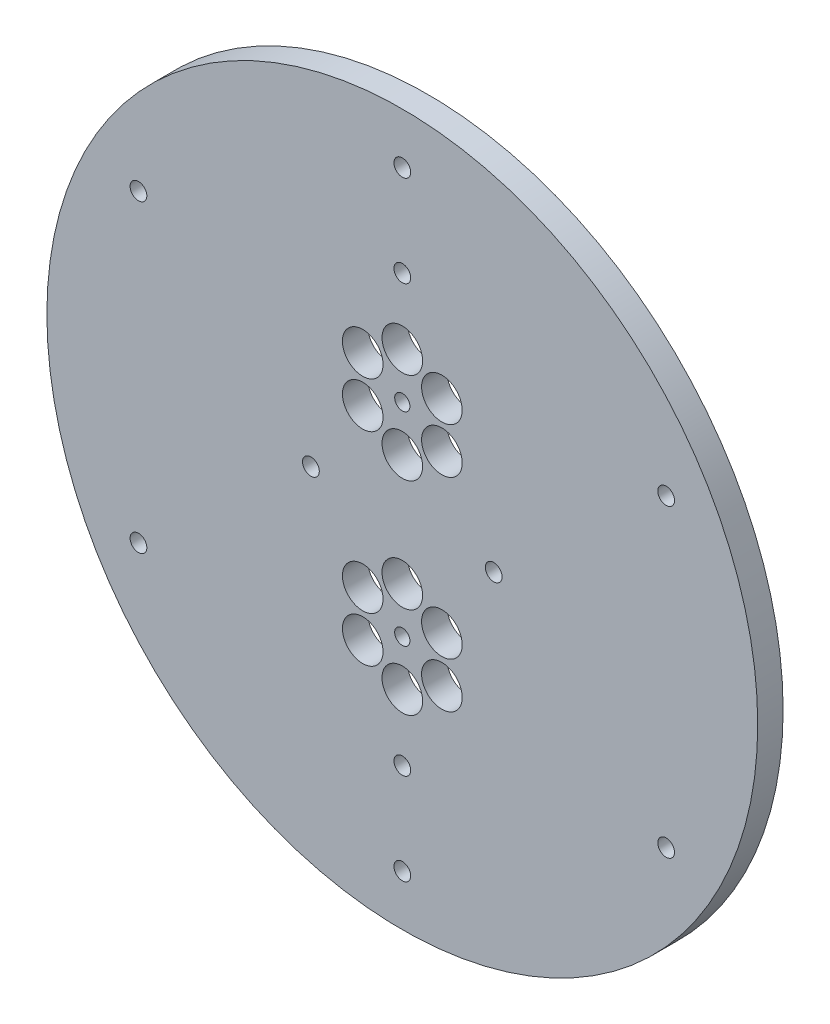
ISO-10303-21;
HEADER;
FILE_DESCRIPTION(('STEP AP214'),'2;1');
FILE_NAME('part.step','',(''),(''),'','','');
FILE_SCHEMA(('AUTOMOTIVE_DESIGN { 1 0 10303 214 1 1 1 1 }'));
ENDSEC;
DATA;
#1=APPLICATION_CONTEXT('core data for automotive mechanical design processes');
#2=APPLICATION_PROTOCOL_DEFINITION('international standard','automotive_design',2000,#1);
#3=PRODUCT_CONTEXT('',#1,'mechanical');
#4=PRODUCT('Part','Part','',(#3));
#5=PRODUCT_RELATED_PRODUCT_CATEGORY('part','',(#4));
#6=PRODUCT_DEFINITION_FORMATION('','',#4);
#7=PRODUCT_DEFINITION_CONTEXT('part definition',#1,'design');
#8=PRODUCT_DEFINITION('design','',#6,#7);
#9=PRODUCT_DEFINITION_SHAPE('','',#8);
#10=(LENGTH_UNIT() NAMED_UNIT(*) SI_UNIT(.MILLI.,.METRE.));
#11=(NAMED_UNIT(*) PLANE_ANGLE_UNIT() SI_UNIT($,.RADIAN.));
#12=(NAMED_UNIT(*) SI_UNIT($,.STERADIAN.) SOLID_ANGLE_UNIT());
#13=UNCERTAINTY_MEASURE_WITH_UNIT(LENGTH_MEASURE(1.E-05),#10,'distance_accuracy_value','');
#14=(GEOMETRIC_REPRESENTATION_CONTEXT(3) GLOBAL_UNCERTAINTY_ASSIGNED_CONTEXT((#13)) GLOBAL_UNIT_ASSIGNED_CONTEXT((#10,
#11,#12)) REPRESENTATION_CONTEXT('',''));
#15=CARTESIAN_POINT('',(0.,0.,0.));
#16=DIRECTION('',(0.,0.,1.));
#17=DIRECTION('',(1.,0.,0.));
#18=AXIS2_PLACEMENT_3D('',#15,#16,#17);
#19=CARTESIAN_POINT('',(0.,0.,5.));
#20=DIRECTION('',(0.,0.,1.));
#21=DIRECTION('',(1.,0.,0.));
#22=AXIS2_PLACEMENT_3D('',#19,#20,#21);
#23=PLANE('',#22);
#24=CARTESIAN_POINT('',(0.,42.,5.));
#25=DIRECTION('',(0.,0.,1.));
#26=DIRECTION('',(1.,0.,0.));
#27=AXIS2_PLACEMENT_3D('',#24,#25,#26);
#28=CIRCLE('',#27,1.65);
#29=CARTESIAN_POINT('',(1.65,42.,5.));
#30=VERTEX_POINT('',#29);
#31=EDGE_CURVE('E181',#30,#30,#28,.T.);
#32=ORIENTED_EDGE('',*,*,#31,.F.);
#33=EDGE_LOOP('',(#32));
#34=FACE_BOUND('',#33,.T.);
#35=CARTESIAN_POINT('',(0.,-42.,5.));
#36=DIRECTION('',(0.,0.,1.));
#37=DIRECTION('',(1.,0.,0.));
#38=AXIS2_PLACEMENT_3D('',#35,#36,#37);
#39=CIRCLE('',#38,1.65);
#40=CARTESIAN_POINT('',(1.65,-42.,5.));
#41=VERTEX_POINT('',#40);
#42=EDGE_CURVE('E175',#41,#41,#39,.T.);
#43=ORIENTED_EDGE('',*,*,#42,.F.);
#44=EDGE_LOOP('',(#43));
#45=FACE_BOUND('',#44,.T.);
#46=CARTESIAN_POINT('',(18.,0.,5.));
#47=DIRECTION('',(0.,0.,1.));
#48=DIRECTION('',(1.,0.,0.));
#49=AXIS2_PLACEMENT_3D('',#46,#47,#48);
#50=CIRCLE('',#49,1.65);
#51=CARTESIAN_POINT('',(19.65,0.,5.));
#52=VERTEX_POINT('',#51);
#53=EDGE_CURVE('E169',#52,#52,#50,.T.);
#54=ORIENTED_EDGE('',*,*,#53,.F.);
#55=EDGE_LOOP('',(#54));
#56=FACE_BOUND('',#55,.T.);
#57=CARTESIAN_POINT('',(-18.,0.,5.));
#58=DIRECTION('',(0.,0.,1.));
#59=DIRECTION('',(1.,0.,0.));
#60=AXIS2_PLACEMENT_3D('',#57,#58,#59);
#61=CIRCLE('',#60,1.65);
#62=CARTESIAN_POINT('',(-16.35,0.,5.));
#63=VERTEX_POINT('',#62);
#64=EDGE_CURVE('E163',#63,#63,#61,.T.);
#65=ORIENTED_EDGE('',*,*,#64,.F.);
#66=EDGE_LOOP('',(#65));
#67=FACE_BOUND('',#66,.T.);
#68=CARTESIAN_POINT('',(0.,-29.,5.));
#69=DIRECTION('',(0.,0.,1.));
#70=DIRECTION('',(-1.,0.,0.));
#71=AXIS2_PLACEMENT_3D('',#68,#69,#70);
#72=CIRCLE('',#71,4.);
#73=CARTESIAN_POINT('',(-4.,-29.,5.));
#74=VERTEX_POINT('',#73);
#75=EDGE_CURVE('E148',#74,#74,#72,.T.);
#76=ORIENTED_EDGE('',*,*,#75,.F.);
#77=EDGE_LOOP('',(#76));
#78=FACE_BOUND('',#77,.T.);
#79=CARTESIAN_POINT('',(0.,-20.,5.));
#80=DIRECTION('',(0.,0.,1.));
#81=DIRECTION('',(-1.,0.,0.));
#82=AXIS2_PLACEMENT_3D('',#79,#80,#81);
#83=CIRCLE('',#82,1.5);
#84=CARTESIAN_POINT('',(-1.5,-20.,5.));
#85=VERTEX_POINT('',#84);
#86=EDGE_CURVE('E136',#85,#85,#83,.T.);
#87=ORIENTED_EDGE('',*,*,#86,.F.);
#88=EDGE_LOOP('',(#87));
#89=FACE_BOUND('',#88,.T.);
#90=CARTESIAN_POINT('',(0.,-11.,5.));
#91=DIRECTION('',(0.,0.,1.));
#92=DIRECTION('',(-1.,0.,0.));
#93=AXIS2_PLACEMENT_3D('',#90,#91,#92);
#94=CIRCLE('',#93,4.);
#95=CARTESIAN_POINT('',(-3.99999999999999,-11.,5.));
#96=VERTEX_POINT('',#95);
#97=EDGE_CURVE('E124',#96,#96,#94,.T.);
#98=ORIENTED_EDGE('',*,*,#97,.F.);
#99=EDGE_LOOP('',(#98));
#100=FACE_BOUND('',#99,.T.);
#101=CARTESIAN_POINT('',(-7.79422863405994,24.5,5.));
#102=DIRECTION('',(0.,0.,1.));
#103=DIRECTION('',(1.,0.,0.));
#104=AXIS2_PLACEMENT_3D('',#101,#102,#103);
#105=CIRCLE('',#104,4.);
#106=CARTESIAN_POINT('',(-3.79422863405994,24.5,5.));
#107=VERTEX_POINT('',#106);
#108=EDGE_CURVE('E112',#107,#107,#105,.T.);
#109=ORIENTED_EDGE('',*,*,#108,.F.);
#110=EDGE_LOOP('',(#109));
#111=FACE_BOUND('',#110,.T.);
#112=CARTESIAN_POINT('',(0.,11.,5.));
#113=DIRECTION('',(0.,0.,1.));
#114=DIRECTION('',(1.,0.,0.));
#115=AXIS2_PLACEMENT_3D('',#112,#113,#114);
#116=CIRCLE('',#115,4.);
#117=CARTESIAN_POINT('',(4.00000000000001,11.,5.));
#118=VERTEX_POINT('',#117);
#119=EDGE_CURVE('E100',#118,#118,#116,.T.);
#120=ORIENTED_EDGE('',*,*,#119,.F.);
#121=EDGE_LOOP('',(#120));
#122=FACE_BOUND('',#121,.T.);
#123=CARTESIAN_POINT('',(7.79422863405995,24.5,5.));
#124=DIRECTION('',(0.,0.,1.));
#125=DIRECTION('',(1.,0.,0.));
#126=AXIS2_PLACEMENT_3D('',#123,#124,#125);
#127=CIRCLE('',#126,4.);
#128=CARTESIAN_POINT('',(11.79422863406,24.5,5.));
#129=VERTEX_POINT('',#128);
#130=EDGE_CURVE('E88',#129,#129,#127,.T.);
#131=ORIENTED_EDGE('',*,*,#130,.F.);
#132=EDGE_LOOP('',(#131));
#133=FACE_BOUND('',#132,.T.);
#134=CARTESIAN_POINT('',(0.,29.,5.));
#135=DIRECTION('',(0.,0.,1.));
#136=DIRECTION('',(1.,0.,0.));
#137=AXIS2_PLACEMENT_3D('',#134,#135,#136);
#138=CIRCLE('',#137,4.);
#139=CARTESIAN_POINT('',(4.,29.,5.));
#140=VERTEX_POINT('',#139);
#141=EDGE_CURVE('E76',#140,#140,#138,.T.);
#142=ORIENTED_EDGE('',*,*,#141,.F.);
#143=EDGE_LOOP('',(#142));
#144=FACE_BOUND('',#143,.T.);
#145=CARTESIAN_POINT('',(-51.9615242270663,-30.,5.));
#146=DIRECTION('',(0.,0.,1.));
#147=DIRECTION('',(1.,0.,0.));
#148=AXIS2_PLACEMENT_3D('',#145,#146,#147);
#149=CIRCLE('',#148,1.65);
#150=CARTESIAN_POINT('',(-50.3115242270663,-30.,5.));
#151=VERTEX_POINT('',#150);
#152=EDGE_CURVE('E64',#151,#151,#149,.T.);
#153=ORIENTED_EDGE('',*,*,#152,.F.);
#154=EDGE_LOOP('',(#153));
#155=FACE_BOUND('',#154,.T.);
#156=CARTESIAN_POINT('',(51.9615242270663,-30.,5.));
#157=DIRECTION('',(0.,0.,1.));
#158=DIRECTION('',(1.,0.,0.));
#159=AXIS2_PLACEMENT_3D('',#156,#157,#158);
#160=CIRCLE('',#159,1.65000000000015);
#161=CARTESIAN_POINT('',(53.6115242270665,-30.,5.));
#162=VERTEX_POINT('',#161);
#163=EDGE_CURVE('E52',#162,#162,#160,.T.);
#164=ORIENTED_EDGE('',*,*,#163,.F.);
#165=EDGE_LOOP('',(#164));
#166=FACE_BOUND('',#165,.T.);
#167=CARTESIAN_POINT('',(0.,60.,5.));
#168=DIRECTION('',(0.,0.,1.));
#169=DIRECTION('',(1.,0.,0.));
#170=AXIS2_PLACEMENT_3D('',#167,#168,#169);
#171=CIRCLE('',#170,1.65);
#172=CARTESIAN_POINT('',(1.65,60.,5.));
#173=VERTEX_POINT('',#172);
#174=EDGE_CURVE('E41',#173,#173,#171,.T.);
#175=ORIENTED_EDGE('',*,*,#174,.F.);
#176=EDGE_LOOP('',(#175));
#177=FACE_BOUND('',#176,.T.);
#178=CARTESIAN_POINT('',(0.,0.,5.));
#179=DIRECTION('',(0.,0.,1.));
#180=DIRECTION('',(1.,0.,0.));
#181=AXIS2_PLACEMENT_3D('',#178,#179,#180);
#182=CIRCLE('',#181,70.);
#183=CARTESIAN_POINT('',(70.,0.,5.));
#184=VERTEX_POINT('',#183);
#185=EDGE_CURVE('E10',#184,#184,#182,.T.);
#186=ORIENTED_EDGE('',*,*,#185,.T.);
#187=EDGE_LOOP('',(#186));
#188=FACE_BOUND('',#187,.T.);
#189=CARTESIAN_POINT('',(51.9615242270663,30.,5.));
#190=DIRECTION('',(0.,0.,1.));
#191=DIRECTION('',(1.,0.,0.));
#192=AXIS2_PLACEMENT_3D('',#189,#190,#191);
#193=CIRCLE('',#192,1.65000000000008);
#194=CARTESIAN_POINT('',(53.6115242270664,30.,5.));
#195=VERTEX_POINT('',#194);
#196=EDGE_CURVE('E46',#195,#195,#193,.T.);
#197=ORIENTED_EDGE('',*,*,#196,.F.);
#198=EDGE_LOOP('',(#197));
#199=FACE_BOUND('',#198,.T.);
#200=CARTESIAN_POINT('',(0.,-60.,5.));
#201=DIRECTION('',(0.,0.,1.));
#202=DIRECTION('',(1.,0.,0.));
#203=AXIS2_PLACEMENT_3D('',#200,#201,#202);
#204=CIRCLE('',#203,1.65);
#205=CARTESIAN_POINT('',(1.65000000000001,-60.,5.));
#206=VERTEX_POINT('',#205);
#207=EDGE_CURVE('E58',#206,#206,#204,.T.);
#208=ORIENTED_EDGE('',*,*,#207,.F.);
#209=EDGE_LOOP('',(#208));
#210=FACE_BOUND('',#209,.T.);
#211=CARTESIAN_POINT('',(-51.9615242270663,30.,5.));
#212=DIRECTION('',(0.,0.,1.));
#213=DIRECTION('',(1.,0.,0.));
#214=AXIS2_PLACEMENT_3D('',#211,#212,#213);
#215=CIRCLE('',#214,1.65);
#216=CARTESIAN_POINT('',(-50.3115242270664,30.,5.));
#217=VERTEX_POINT('',#216);
#218=EDGE_CURVE('E70',#217,#217,#215,.T.);
#219=ORIENTED_EDGE('',*,*,#218,.F.);
#220=EDGE_LOOP('',(#219));
#221=FACE_BOUND('',#220,.T.);
#222=CARTESIAN_POINT('',(0.,20.,5.));
#223=DIRECTION('',(0.,0.,1.));
#224=DIRECTION('',(1.,0.,0.));
#225=AXIS2_PLACEMENT_3D('',#222,#223,#224);
#226=CIRCLE('',#225,1.5);
#227=CARTESIAN_POINT('',(1.5,20.,5.));
#228=VERTEX_POINT('',#227);
#229=EDGE_CURVE('E82',#228,#228,#226,.T.);
#230=ORIENTED_EDGE('',*,*,#229,.F.);
#231=EDGE_LOOP('',(#230));
#232=FACE_BOUND('',#231,.T.);
#233=CARTESIAN_POINT('',(7.79422863405995,15.5,5.));
#234=DIRECTION('',(0.,0.,1.));
#235=DIRECTION('',(1.,0.,0.));
#236=AXIS2_PLACEMENT_3D('',#233,#234,#235);
#237=CIRCLE('',#236,4.);
#238=CARTESIAN_POINT('',(11.79422863406,15.5,5.));
#239=VERTEX_POINT('',#238);
#240=EDGE_CURVE('E94',#239,#239,#237,.T.);
#241=ORIENTED_EDGE('',*,*,#240,.F.);
#242=EDGE_LOOP('',(#241));
#243=FACE_BOUND('',#242,.T.);
#244=CARTESIAN_POINT('',(-7.79422863405994,15.5,5.));
#245=DIRECTION('',(0.,0.,1.));
#246=DIRECTION('',(1.,0.,0.));
#247=AXIS2_PLACEMENT_3D('',#244,#245,#246);
#248=CIRCLE('',#247,4.);
#249=CARTESIAN_POINT('',(-3.79422863405994,15.5,5.));
#250=VERTEX_POINT('',#249);
#251=EDGE_CURVE('E106',#250,#250,#248,.T.);
#252=ORIENTED_EDGE('',*,*,#251,.F.);
#253=EDGE_LOOP('',(#252));
#254=FACE_BOUND('',#253,.T.);
#255=CARTESIAN_POINT('',(7.79422863405995,-15.5,5.));
#256=DIRECTION('',(0.,0.,1.));
#257=DIRECTION('',(-1.,0.,0.));
#258=AXIS2_PLACEMENT_3D('',#255,#256,#257);
#259=CIRCLE('',#258,4.);
#260=CARTESIAN_POINT('',(3.79422863405995,-15.5,5.));
#261=VERTEX_POINT('',#260);
#262=EDGE_CURVE('E118',#261,#261,#259,.T.);
#263=ORIENTED_EDGE('',*,*,#262,.F.);
#264=EDGE_LOOP('',(#263));
#265=FACE_BOUND('',#264,.T.);
#266=CARTESIAN_POINT('',(-7.79422863405994,-15.5,5.));
#267=DIRECTION('',(0.,0.,1.));
#268=DIRECTION('',(-1.,0.,0.));
#269=AXIS2_PLACEMENT_3D('',#266,#267,#268);
#270=CIRCLE('',#269,4.);
#271=CARTESIAN_POINT('',(-11.7942286340599,-15.5,5.));
#272=VERTEX_POINT('',#271);
#273=EDGE_CURVE('E130',#272,#272,#270,.T.);
#274=ORIENTED_EDGE('',*,*,#273,.F.);
#275=EDGE_LOOP('',(#274));
#276=FACE_BOUND('',#275,.T.);
#277=CARTESIAN_POINT('',(-7.79422863405994,-24.5,5.));
#278=DIRECTION('',(0.,0.,1.));
#279=DIRECTION('',(-1.,0.,0.));
#280=AXIS2_PLACEMENT_3D('',#277,#278,#279);
#281=CIRCLE('',#280,4.);
#282=CARTESIAN_POINT('',(-11.7942286340599,-24.5,5.));
#283=VERTEX_POINT('',#282);
#284=EDGE_CURVE('E142',#283,#283,#281,.T.);
#285=ORIENTED_EDGE('',*,*,#284,.F.);
#286=EDGE_LOOP('',(#285));
#287=FACE_BOUND('',#286,.T.);
#288=CARTESIAN_POINT('',(7.79422863405995,-24.5,5.));
#289=DIRECTION('',(0.,0.,1.));
#290=DIRECTION('',(-1.,0.,0.));
#291=AXIS2_PLACEMENT_3D('',#288,#289,#290);
#292=CIRCLE('',#291,4.);
#293=CARTESIAN_POINT('',(3.79422863405995,-24.5,5.));
#294=VERTEX_POINT('',#293);
#295=EDGE_CURVE('E154',#294,#294,#292,.T.);
#296=ORIENTED_EDGE('',*,*,#295,.F.);
#297=EDGE_LOOP('',(#296));
#298=FACE_BOUND('',#297,.T.);
#299=ADVANCED_FACE('F30',(#34,#45,#56,#67,#78,#89,#100,#111,#122,#133,#144,#155,#166,#177,#188,
#199,#210,#221,#232,#243,#254,#265,#276,#287,#298),#23,.T.);
#300=CARTESIAN_POINT('',(0.,0.,0.));
#301=DIRECTION('',(0.,0.,1.));
#302=DIRECTION('',(1.,0.,0.));
#303=AXIS2_PLACEMENT_3D('',#300,#301,#302);
#304=PLANE('',#303);
#305=CARTESIAN_POINT('',(0.,42.,0.));
#306=DIRECTION('',(0.,0.,1.));
#307=DIRECTION('',(1.,0.,0.));
#308=AXIS2_PLACEMENT_3D('',#305,#306,#307);
#309=CIRCLE('',#308,1.65);
#310=CARTESIAN_POINT('',(1.65,42.,0.));
#311=VERTEX_POINT('',#310);
#312=EDGE_CURVE('E160',#311,#311,#309,.T.);
#313=ORIENTED_EDGE('',*,*,#312,.T.);
#314=EDGE_LOOP('',(#313));
#315=FACE_BOUND('',#314,.T.);
#316=CARTESIAN_POINT('',(0.,-42.,0.));
#317=DIRECTION('',(0.,0.,1.));
#318=DIRECTION('',(1.,0.,0.));
#319=AXIS2_PLACEMENT_3D('',#316,#317,#318);
#320=CIRCLE('',#319,1.65);
#321=CARTESIAN_POINT('',(1.65,-42.,0.));
#322=VERTEX_POINT('',#321);
#323=EDGE_CURVE('E178',#322,#322,#320,.T.);
#324=ORIENTED_EDGE('',*,*,#323,.T.);
#325=EDGE_LOOP('',(#324));
#326=FACE_BOUND('',#325,.T.);
#327=CARTESIAN_POINT('',(18.,0.,0.));
#328=DIRECTION('',(0.,0.,1.));
#329=DIRECTION('',(1.,0.,0.));
#330=AXIS2_PLACEMENT_3D('',#327,#328,#329);
#331=CIRCLE('',#330,1.65);
#332=CARTESIAN_POINT('',(19.65,0.,0.));
#333=VERTEX_POINT('',#332);
#334=EDGE_CURVE('E172',#333,#333,#331,.T.);
#335=ORIENTED_EDGE('',*,*,#334,.T.);
#336=EDGE_LOOP('',(#335));
#337=FACE_BOUND('',#336,.T.);
#338=CARTESIAN_POINT('',(-18.,0.,0.));
#339=DIRECTION('',(0.,0.,1.));
#340=DIRECTION('',(1.,0.,0.));
#341=AXIS2_PLACEMENT_3D('',#338,#339,#340);
#342=CIRCLE('',#341,1.65);
#343=CARTESIAN_POINT('',(-16.35,0.,0.));
#344=VERTEX_POINT('',#343);
#345=EDGE_CURVE('E166',#344,#344,#342,.T.);
#346=ORIENTED_EDGE('',*,*,#345,.T.);
#347=EDGE_LOOP('',(#346));
#348=FACE_BOUND('',#347,.T.);
#349=CARTESIAN_POINT('',(0.,0.,0.));
#350=DIRECTION('',(0.,0.,1.));
#351=DIRECTION('',(1.,0.,0.));
#352=AXIS2_PLACEMENT_3D('',#349,#350,#351);
#353=CIRCLE('',#352,70.);
#354=CARTESIAN_POINT('',(70.,0.,0.));
#355=VERTEX_POINT('',#354);
#356=EDGE_CURVE('E34',#355,#355,#353,.T.);
#357=ORIENTED_EDGE('',*,*,#356,.F.);
#358=EDGE_LOOP('',(#357));
#359=FACE_BOUND('',#358,.T.);
#360=CARTESIAN_POINT('',(0.,60.,0.));
#361=DIRECTION('',(0.,0.,1.));
#362=DIRECTION('',(1.,0.,0.));
#363=AXIS2_PLACEMENT_3D('',#360,#361,#362);
#364=CIRCLE('',#363,1.65);
#365=CARTESIAN_POINT('',(1.65,60.,0.));
#366=VERTEX_POINT('',#365);
#367=EDGE_CURVE('E43',#366,#366,#364,.T.);
#368=ORIENTED_EDGE('',*,*,#367,.T.);
#369=EDGE_LOOP('',(#368));
#370=FACE_BOUND('',#369,.T.);
#371=CARTESIAN_POINT('',(51.9615242270663,30.,0.));
#372=DIRECTION('',(0.,0.,1.));
#373=DIRECTION('',(1.,0.,0.));
#374=AXIS2_PLACEMENT_3D('',#371,#372,#373);
#375=CIRCLE('',#374,1.65000000000008);
#376=CARTESIAN_POINT('',(53.6115242270664,30.,0.));
#377=VERTEX_POINT('',#376);
#378=EDGE_CURVE('E49',#377,#377,#375,.T.);
#379=ORIENTED_EDGE('',*,*,#378,.T.);
#380=EDGE_LOOP('',(#379));
#381=FACE_BOUND('',#380,.T.);
#382=CARTESIAN_POINT('',(51.9615242270663,-30.,0.));
#383=DIRECTION('',(0.,0.,1.));
#384=DIRECTION('',(1.,0.,0.));
#385=AXIS2_PLACEMENT_3D('',#382,#383,#384);
#386=CIRCLE('',#385,1.65000000000015);
#387=CARTESIAN_POINT('',(53.6115242270665,-30.,0.));
#388=VERTEX_POINT('',#387);
#389=EDGE_CURVE('E55',#388,#388,#386,.T.);
#390=ORIENTED_EDGE('',*,*,#389,.T.);
#391=EDGE_LOOP('',(#390));
#392=FACE_BOUND('',#391,.T.);
#393=CARTESIAN_POINT('',(0.,-60.,0.));
#394=DIRECTION('',(0.,0.,1.));
#395=DIRECTION('',(1.,0.,0.));
#396=AXIS2_PLACEMENT_3D('',#393,#394,#395);
#397=CIRCLE('',#396,1.65);
#398=CARTESIAN_POINT('',(1.65000000000001,-60.,0.));
#399=VERTEX_POINT('',#398);
#400=EDGE_CURVE('E61',#399,#399,#397,.T.);
#401=ORIENTED_EDGE('',*,*,#400,.T.);
#402=EDGE_LOOP('',(#401));
#403=FACE_BOUND('',#402,.T.);
#404=CARTESIAN_POINT('',(-51.9615242270663,-30.,0.));
#405=DIRECTION('',(0.,0.,1.));
#406=DIRECTION('',(1.,0.,0.));
#407=AXIS2_PLACEMENT_3D('',#404,#405,#406);
#408=CIRCLE('',#407,1.65);
#409=CARTESIAN_POINT('',(-50.3115242270663,-30.,0.));
#410=VERTEX_POINT('',#409);
#411=EDGE_CURVE('E67',#410,#410,#408,.T.);
#412=ORIENTED_EDGE('',*,*,#411,.T.);
#413=EDGE_LOOP('',(#412));
#414=FACE_BOUND('',#413,.T.);
#415=CARTESIAN_POINT('',(-51.9615242270663,30.,0.));
#416=DIRECTION('',(0.,0.,1.));
#417=DIRECTION('',(1.,0.,0.));
#418=AXIS2_PLACEMENT_3D('',#415,#416,#417);
#419=CIRCLE('',#418,1.65);
#420=CARTESIAN_POINT('',(-50.3115242270664,30.,0.));
#421=VERTEX_POINT('',#420);
#422=EDGE_CURVE('E73',#421,#421,#419,.T.);
#423=ORIENTED_EDGE('',*,*,#422,.T.);
#424=EDGE_LOOP('',(#423));
#425=FACE_BOUND('',#424,.T.);
#426=CARTESIAN_POINT('',(0.,29.,0.));
#427=DIRECTION('',(0.,0.,1.));
#428=DIRECTION('',(1.,0.,0.));
#429=AXIS2_PLACEMENT_3D('',#426,#427,#428);
#430=CIRCLE('',#429,4.);
#431=CARTESIAN_POINT('',(4.,29.,0.));
#432=VERTEX_POINT('',#431);
#433=EDGE_CURVE('E79',#432,#432,#430,.T.);
#434=ORIENTED_EDGE('',*,*,#433,.T.);
#435=EDGE_LOOP('',(#434));
#436=FACE_BOUND('',#435,.T.);
#437=CARTESIAN_POINT('',(0.,20.,0.));
#438=DIRECTION('',(0.,0.,1.));
#439=DIRECTION('',(1.,0.,0.));
#440=AXIS2_PLACEMENT_3D('',#437,#438,#439);
#441=CIRCLE('',#440,1.5);
#442=CARTESIAN_POINT('',(1.5,20.,0.));
#443=VERTEX_POINT('',#442);
#444=EDGE_CURVE('E85',#443,#443,#441,.T.);
#445=ORIENTED_EDGE('',*,*,#444,.T.);
#446=EDGE_LOOP('',(#445));
#447=FACE_BOUND('',#446,.T.);
#448=CARTESIAN_POINT('',(7.79422863405995,24.5,0.));
#449=DIRECTION('',(0.,0.,1.));
#450=DIRECTION('',(1.,0.,0.));
#451=AXIS2_PLACEMENT_3D('',#448,#449,#450);
#452=CIRCLE('',#451,4.);
#453=CARTESIAN_POINT('',(11.79422863406,24.5,0.));
#454=VERTEX_POINT('',#453);
#455=EDGE_CURVE('E91',#454,#454,#452,.T.);
#456=ORIENTED_EDGE('',*,*,#455,.T.);
#457=EDGE_LOOP('',(#456));
#458=FACE_BOUND('',#457,.T.);
#459=CARTESIAN_POINT('',(7.79422863405995,15.5,0.));
#460=DIRECTION('',(0.,0.,1.));
#461=DIRECTION('',(1.,0.,0.));
#462=AXIS2_PLACEMENT_3D('',#459,#460,#461);
#463=CIRCLE('',#462,4.);
#464=CARTESIAN_POINT('',(11.79422863406,15.5,0.));
#465=VERTEX_POINT('',#464);
#466=EDGE_CURVE('E97',#465,#465,#463,.T.);
#467=ORIENTED_EDGE('',*,*,#466,.T.);
#468=EDGE_LOOP('',(#467));
#469=FACE_BOUND('',#468,.T.);
#470=CARTESIAN_POINT('',(0.,11.,0.));
#471=DIRECTION('',(0.,0.,1.));
#472=DIRECTION('',(1.,0.,0.));
#473=AXIS2_PLACEMENT_3D('',#470,#471,#472);
#474=CIRCLE('',#473,4.);
#475=CARTESIAN_POINT('',(4.00000000000001,11.,0.));
#476=VERTEX_POINT('',#475);
#477=EDGE_CURVE('E103',#476,#476,#474,.T.);
#478=ORIENTED_EDGE('',*,*,#477,.T.);
#479=EDGE_LOOP('',(#478));
#480=FACE_BOUND('',#479,.T.);
#481=CARTESIAN_POINT('',(-7.79422863405994,15.5,0.));
#482=DIRECTION('',(0.,0.,1.));
#483=DIRECTION('',(1.,0.,0.));
#484=AXIS2_PLACEMENT_3D('',#481,#482,#483);
#485=CIRCLE('',#484,4.);
#486=CARTESIAN_POINT('',(-3.79422863405994,15.5,0.));
#487=VERTEX_POINT('',#486);
#488=EDGE_CURVE('E109',#487,#487,#485,.T.);
#489=ORIENTED_EDGE('',*,*,#488,.T.);
#490=EDGE_LOOP('',(#489));
#491=FACE_BOUND('',#490,.T.);
#492=CARTESIAN_POINT('',(-7.79422863405994,24.5,0.));
#493=DIRECTION('',(0.,0.,1.));
#494=DIRECTION('',(1.,0.,0.));
#495=AXIS2_PLACEMENT_3D('',#492,#493,#494);
#496=CIRCLE('',#495,4.);
#497=CARTESIAN_POINT('',(-3.79422863405994,24.5,0.));
#498=VERTEX_POINT('',#497);
#499=EDGE_CURVE('E115',#498,#498,#496,.T.);
#500=ORIENTED_EDGE('',*,*,#499,.T.);
#501=EDGE_LOOP('',(#500));
#502=FACE_BOUND('',#501,.T.);
#503=CARTESIAN_POINT('',(7.79422863405995,-15.5,0.));
#504=DIRECTION('',(0.,0.,1.));
#505=DIRECTION('',(-1.,0.,0.));
#506=AXIS2_PLACEMENT_3D('',#503,#504,#505);
#507=CIRCLE('',#506,4.);
#508=CARTESIAN_POINT('',(3.79422863405995,-15.5,0.));
#509=VERTEX_POINT('',#508);
#510=EDGE_CURVE('E121',#509,#509,#507,.T.);
#511=ORIENTED_EDGE('',*,*,#510,.T.);
#512=EDGE_LOOP('',(#511));
#513=FACE_BOUND('',#512,.T.);
#514=CARTESIAN_POINT('',(0.,-11.,0.));
#515=DIRECTION('',(0.,0.,1.));
#516=DIRECTION('',(-1.,0.,0.));
#517=AXIS2_PLACEMENT_3D('',#514,#515,#516);
#518=CIRCLE('',#517,4.);
#519=CARTESIAN_POINT('',(-3.99999999999999,-11.,0.));
#520=VERTEX_POINT('',#519);
#521=EDGE_CURVE('E127',#520,#520,#518,.T.);
#522=ORIENTED_EDGE('',*,*,#521,.T.);
#523=EDGE_LOOP('',(#522));
#524=FACE_BOUND('',#523,.T.);
#525=CARTESIAN_POINT('',(-7.79422863405994,-15.5,0.));
#526=DIRECTION('',(0.,0.,1.));
#527=DIRECTION('',(-1.,0.,0.));
#528=AXIS2_PLACEMENT_3D('',#525,#526,#527);
#529=CIRCLE('',#528,4.);
#530=CARTESIAN_POINT('',(-11.7942286340599,-15.5,0.));
#531=VERTEX_POINT('',#530);
#532=EDGE_CURVE('E133',#531,#531,#529,.T.);
#533=ORIENTED_EDGE('',*,*,#532,.T.);
#534=EDGE_LOOP('',(#533));
#535=FACE_BOUND('',#534,.T.);
#536=CARTESIAN_POINT('',(0.,-20.,0.));
#537=DIRECTION('',(0.,0.,1.));
#538=DIRECTION('',(-1.,0.,0.));
#539=AXIS2_PLACEMENT_3D('',#536,#537,#538);
#540=CIRCLE('',#539,1.5);
#541=CARTESIAN_POINT('',(-1.5,-20.,0.));
#542=VERTEX_POINT('',#541);
#543=EDGE_CURVE('E139',#542,#542,#540,.T.);
#544=ORIENTED_EDGE('',*,*,#543,.T.);
#545=EDGE_LOOP('',(#544));
#546=FACE_BOUND('',#545,.T.);
#547=CARTESIAN_POINT('',(-7.79422863405994,-24.5,0.));
#548=DIRECTION('',(0.,0.,1.));
#549=DIRECTION('',(-1.,0.,0.));
#550=AXIS2_PLACEMENT_3D('',#547,#548,#549);
#551=CIRCLE('',#550,4.);
#552=CARTESIAN_POINT('',(-11.7942286340599,-24.5,0.));
#553=VERTEX_POINT('',#552);
#554=EDGE_CURVE('E145',#553,#553,#551,.T.);
#555=ORIENTED_EDGE('',*,*,#554,.T.);
#556=EDGE_LOOP('',(#555));
#557=FACE_BOUND('',#556,.T.);
#558=CARTESIAN_POINT('',(0.,-29.,0.));
#559=DIRECTION('',(0.,0.,1.));
#560=DIRECTION('',(-1.,0.,0.));
#561=AXIS2_PLACEMENT_3D('',#558,#559,#560);
#562=CIRCLE('',#561,4.);
#563=CARTESIAN_POINT('',(-4.,-29.,0.));
#564=VERTEX_POINT('',#563);
#565=EDGE_CURVE('E151',#564,#564,#562,.T.);
#566=ORIENTED_EDGE('',*,*,#565,.T.);
#567=EDGE_LOOP('',(#566));
#568=FACE_BOUND('',#567,.T.);
#569=CARTESIAN_POINT('',(7.79422863405995,-24.5,0.));
#570=DIRECTION('',(0.,0.,1.));
#571=DIRECTION('',(-1.,0.,0.));
#572=AXIS2_PLACEMENT_3D('',#569,#570,#571);
#573=CIRCLE('',#572,4.);
#574=CARTESIAN_POINT('',(3.79422863405995,-24.5,0.));
#575=VERTEX_POINT('',#574);
#576=EDGE_CURVE('E157',#575,#575,#573,.T.);
#577=ORIENTED_EDGE('',*,*,#576,.T.);
#578=EDGE_LOOP('',(#577));
#579=FACE_BOUND('',#578,.T.);
#580=ADVANCED_FACE('F187',(#315,#326,#337,#348,#359,#370,#381,#392,#403,#414,#425,#436,#447,
#458,#469,#480,#491,#502,#513,#524,#535,#546,#557,#568,#579),#304,.F.);
#581=CARTESIAN_POINT('',(0.,0.,5.));
#582=DIRECTION('',(0.,0.,-1.));
#583=DIRECTION('',(-1.,0.,0.));
#584=AXIS2_PLACEMENT_3D('',#581,#582,#583);
#585=CYLINDRICAL_SURFACE('',#584,70.);
#586=ORIENTED_EDGE('',*,*,#185,.F.);
#587=EDGE_LOOP('',(#586));
#588=FACE_BOUND('',#587,.T.);
#589=ORIENTED_EDGE('',*,*,#356,.T.);
#590=EDGE_LOOP('',(#589));
#591=FACE_BOUND('',#590,.T.);
#592=ADVANCED_FACE('F32',(#588,#591),#585,.T.);
#593=CARTESIAN_POINT('',(0.,60.,5.));
#594=DIRECTION('',(0.,0.,-1.));
#595=DIRECTION('',(-1.,0.,0.));
#596=AXIS2_PLACEMENT_3D('',#593,#594,#595);
#597=CYLINDRICAL_SURFACE('',#596,1.65);
#598=ORIENTED_EDGE('',*,*,#174,.T.);
#599=EDGE_LOOP('',(#598));
#600=FACE_BOUND('',#599,.T.);
#601=ORIENTED_EDGE('',*,*,#367,.F.);
#602=EDGE_LOOP('',(#601));
#603=FACE_BOUND('',#602,.T.);
#604=ADVANCED_FACE('F258',(#600,#603),#597,.F.);
#605=CARTESIAN_POINT('',(51.9615242270663,30.,5.));
#606=DIRECTION('',(0.,0.,-1.));
#607=DIRECTION('',(-1.,0.,0.));
#608=AXIS2_PLACEMENT_3D('',#605,#606,#607);
#609=CYLINDRICAL_SURFACE('',#608,1.65000000000008);
#610=ORIENTED_EDGE('',*,*,#196,.T.);
#611=EDGE_LOOP('',(#610));
#612=FACE_BOUND('',#611,.T.);
#613=ORIENTED_EDGE('',*,*,#378,.F.);
#614=EDGE_LOOP('',(#613));
#615=FACE_BOUND('',#614,.T.);
#616=ADVANCED_FACE('F263',(#612,#615),#609,.F.);
#617=CARTESIAN_POINT('',(51.9615242270663,-30.,5.));
#618=DIRECTION('',(0.,0.,-1.));
#619=DIRECTION('',(-1.,0.,0.));
#620=AXIS2_PLACEMENT_3D('',#617,#618,#619);
#621=CYLINDRICAL_SURFACE('',#620,1.65000000000015);
#622=ORIENTED_EDGE('',*,*,#163,.T.);
#623=EDGE_LOOP('',(#622));
#624=FACE_BOUND('',#623,.T.);
#625=ORIENTED_EDGE('',*,*,#389,.F.);
#626=EDGE_LOOP('',(#625));
#627=FACE_BOUND('',#626,.T.);
#628=ADVANCED_FACE('F267',(#624,#627),#621,.F.);
#629=CARTESIAN_POINT('',(0.,-60.,5.));
#630=DIRECTION('',(0.,0.,-1.));
#631=DIRECTION('',(-1.,0.,0.));
#632=AXIS2_PLACEMENT_3D('',#629,#630,#631);
#633=CYLINDRICAL_SURFACE('',#632,1.65);
#634=ORIENTED_EDGE('',*,*,#207,.T.);
#635=EDGE_LOOP('',(#634));
#636=FACE_BOUND('',#635,.T.);
#637=ORIENTED_EDGE('',*,*,#400,.F.);
#638=EDGE_LOOP('',(#637));
#639=FACE_BOUND('',#638,.T.);
#640=ADVANCED_FACE('F271',(#636,#639),#633,.F.);
#641=CARTESIAN_POINT('',(-51.9615242270663,-30.,5.));
#642=DIRECTION('',(0.,0.,-1.));
#643=DIRECTION('',(-1.,0.,0.));
#644=AXIS2_PLACEMENT_3D('',#641,#642,#643);
#645=CYLINDRICAL_SURFACE('',#644,1.65);
#646=ORIENTED_EDGE('',*,*,#152,.T.);
#647=EDGE_LOOP('',(#646));
#648=FACE_BOUND('',#647,.T.);
#649=ORIENTED_EDGE('',*,*,#411,.F.);
#650=EDGE_LOOP('',(#649));
#651=FACE_BOUND('',#650,.T.);
#652=ADVANCED_FACE('F275',(#648,#651),#645,.F.);
#653=CARTESIAN_POINT('',(-51.9615242270663,30.,5.));
#654=DIRECTION('',(0.,0.,-1.));
#655=DIRECTION('',(-1.,0.,0.));
#656=AXIS2_PLACEMENT_3D('',#653,#654,#655);
#657=CYLINDRICAL_SURFACE('',#656,1.65);
#658=ORIENTED_EDGE('',*,*,#218,.T.);
#659=EDGE_LOOP('',(#658));
#660=FACE_BOUND('',#659,.T.);
#661=ORIENTED_EDGE('',*,*,#422,.F.);
#662=EDGE_LOOP('',(#661));
#663=FACE_BOUND('',#662,.T.);
#664=ADVANCED_FACE('F279',(#660,#663),#657,.F.);
#665=CARTESIAN_POINT('',(0.,29.,5.));
#666=DIRECTION('',(0.,0.,-1.));
#667=DIRECTION('',(-1.,0.,0.));
#668=AXIS2_PLACEMENT_3D('',#665,#666,#667);
#669=CYLINDRICAL_SURFACE('',#668,4.);
#670=ORIENTED_EDGE('',*,*,#141,.T.);
#671=EDGE_LOOP('',(#670));
#672=FACE_BOUND('',#671,.T.);
#673=ORIENTED_EDGE('',*,*,#433,.F.);
#674=EDGE_LOOP('',(#673));
#675=FACE_BOUND('',#674,.T.);
#676=ADVANCED_FACE('F283',(#672,#675),#669,.F.);
#677=CARTESIAN_POINT('',(0.,20.,5.));
#678=DIRECTION('',(0.,0.,-1.));
#679=DIRECTION('',(-1.,0.,0.));
#680=AXIS2_PLACEMENT_3D('',#677,#678,#679);
#681=CYLINDRICAL_SURFACE('',#680,1.5);
#682=ORIENTED_EDGE('',*,*,#229,.T.);
#683=EDGE_LOOP('',(#682));
#684=FACE_BOUND('',#683,.T.);
#685=ORIENTED_EDGE('',*,*,#444,.F.);
#686=EDGE_LOOP('',(#685));
#687=FACE_BOUND('',#686,.T.);
#688=ADVANCED_FACE('F287',(#684,#687),#681,.F.);
#689=CARTESIAN_POINT('',(7.79422863405995,24.5,5.));
#690=DIRECTION('',(0.,0.,-1.));
#691=DIRECTION('',(-1.,0.,0.));
#692=AXIS2_PLACEMENT_3D('',#689,#690,#691);
#693=CYLINDRICAL_SURFACE('',#692,4.);
#694=ORIENTED_EDGE('',*,*,#130,.T.);
#695=EDGE_LOOP('',(#694));
#696=FACE_BOUND('',#695,.T.);
#697=ORIENTED_EDGE('',*,*,#455,.F.);
#698=EDGE_LOOP('',(#697));
#699=FACE_BOUND('',#698,.T.);
#700=ADVANCED_FACE('F291',(#696,#699),#693,.F.);
#701=CARTESIAN_POINT('',(7.79422863405995,15.5,5.));
#702=DIRECTION('',(0.,0.,-1.));
#703=DIRECTION('',(-1.,0.,0.));
#704=AXIS2_PLACEMENT_3D('',#701,#702,#703);
#705=CYLINDRICAL_SURFACE('',#704,4.);
#706=ORIENTED_EDGE('',*,*,#240,.T.);
#707=EDGE_LOOP('',(#706));
#708=FACE_BOUND('',#707,.T.);
#709=ORIENTED_EDGE('',*,*,#466,.F.);
#710=EDGE_LOOP('',(#709));
#711=FACE_BOUND('',#710,.T.);
#712=ADVANCED_FACE('F295',(#708,#711),#705,.F.);
#713=CARTESIAN_POINT('',(0.,11.,5.));
#714=DIRECTION('',(0.,0.,-1.));
#715=DIRECTION('',(-1.,0.,0.));
#716=AXIS2_PLACEMENT_3D('',#713,#714,#715);
#717=CYLINDRICAL_SURFACE('',#716,4.);
#718=ORIENTED_EDGE('',*,*,#119,.T.);
#719=EDGE_LOOP('',(#718));
#720=FACE_BOUND('',#719,.T.);
#721=ORIENTED_EDGE('',*,*,#477,.F.);
#722=EDGE_LOOP('',(#721));
#723=FACE_BOUND('',#722,.T.);
#724=ADVANCED_FACE('F299',(#720,#723),#717,.F.);
#725=CARTESIAN_POINT('',(-7.79422863405994,15.5,5.));
#726=DIRECTION('',(0.,0.,-1.));
#727=DIRECTION('',(-1.,0.,0.));
#728=AXIS2_PLACEMENT_3D('',#725,#726,#727);
#729=CYLINDRICAL_SURFACE('',#728,4.);
#730=ORIENTED_EDGE('',*,*,#251,.T.);
#731=EDGE_LOOP('',(#730));
#732=FACE_BOUND('',#731,.T.);
#733=ORIENTED_EDGE('',*,*,#488,.F.);
#734=EDGE_LOOP('',(#733));
#735=FACE_BOUND('',#734,.T.);
#736=ADVANCED_FACE('F303',(#732,#735),#729,.F.);
#737=CARTESIAN_POINT('',(-7.79422863405994,24.5,5.));
#738=DIRECTION('',(0.,0.,-1.));
#739=DIRECTION('',(-1.,0.,0.));
#740=AXIS2_PLACEMENT_3D('',#737,#738,#739);
#741=CYLINDRICAL_SURFACE('',#740,4.);
#742=ORIENTED_EDGE('',*,*,#108,.T.);
#743=EDGE_LOOP('',(#742));
#744=FACE_BOUND('',#743,.T.);
#745=ORIENTED_EDGE('',*,*,#499,.F.);
#746=EDGE_LOOP('',(#745));
#747=FACE_BOUND('',#746,.T.);
#748=ADVANCED_FACE('F307',(#744,#747),#741,.F.);
#749=CARTESIAN_POINT('',(7.79422863405995,-15.5,5.));
#750=DIRECTION('',(0.,0.,-1.));
#751=DIRECTION('',(-1.,0.,0.));
#752=AXIS2_PLACEMENT_3D('',#749,#750,#751);
#753=CYLINDRICAL_SURFACE('',#752,4.);
#754=ORIENTED_EDGE('',*,*,#262,.T.);
#755=EDGE_LOOP('',(#754));
#756=FACE_BOUND('',#755,.T.);
#757=ORIENTED_EDGE('',*,*,#510,.F.);
#758=EDGE_LOOP('',(#757));
#759=FACE_BOUND('',#758,.T.);
#760=ADVANCED_FACE('F311',(#756,#759),#753,.F.);
#761=CARTESIAN_POINT('',(0.,-11.,5.));
#762=DIRECTION('',(0.,0.,-1.));
#763=DIRECTION('',(-1.,0.,0.));
#764=AXIS2_PLACEMENT_3D('',#761,#762,#763);
#765=CYLINDRICAL_SURFACE('',#764,4.);
#766=ORIENTED_EDGE('',*,*,#97,.T.);
#767=EDGE_LOOP('',(#766));
#768=FACE_BOUND('',#767,.T.);
#769=ORIENTED_EDGE('',*,*,#521,.F.);
#770=EDGE_LOOP('',(#769));
#771=FACE_BOUND('',#770,.T.);
#772=ADVANCED_FACE('F315',(#768,#771),#765,.F.);
#773=CARTESIAN_POINT('',(-7.79422863405994,-15.5,5.));
#774=DIRECTION('',(0.,0.,-1.));
#775=DIRECTION('',(-1.,0.,0.));
#776=AXIS2_PLACEMENT_3D('',#773,#774,#775);
#777=CYLINDRICAL_SURFACE('',#776,4.);
#778=ORIENTED_EDGE('',*,*,#273,.T.);
#779=EDGE_LOOP('',(#778));
#780=FACE_BOUND('',#779,.T.);
#781=ORIENTED_EDGE('',*,*,#532,.F.);
#782=EDGE_LOOP('',(#781));
#783=FACE_BOUND('',#782,.T.);
#784=ADVANCED_FACE('F319',(#780,#783),#777,.F.);
#785=CARTESIAN_POINT('',(0.,-20.,5.));
#786=DIRECTION('',(0.,0.,-1.));
#787=DIRECTION('',(-1.,0.,0.));
#788=AXIS2_PLACEMENT_3D('',#785,#786,#787);
#789=CYLINDRICAL_SURFACE('',#788,1.5);
#790=ORIENTED_EDGE('',*,*,#86,.T.);
#791=EDGE_LOOP('',(#790));
#792=FACE_BOUND('',#791,.T.);
#793=ORIENTED_EDGE('',*,*,#543,.F.);
#794=EDGE_LOOP('',(#793));
#795=FACE_BOUND('',#794,.T.);
#796=ADVANCED_FACE('F323',(#792,#795),#789,.F.);
#797=CARTESIAN_POINT('',(-7.79422863405994,-24.5,5.));
#798=DIRECTION('',(0.,0.,-1.));
#799=DIRECTION('',(-1.,0.,0.));
#800=AXIS2_PLACEMENT_3D('',#797,#798,#799);
#801=CYLINDRICAL_SURFACE('',#800,4.);
#802=ORIENTED_EDGE('',*,*,#284,.T.);
#803=EDGE_LOOP('',(#802));
#804=FACE_BOUND('',#803,.T.);
#805=ORIENTED_EDGE('',*,*,#554,.F.);
#806=EDGE_LOOP('',(#805));
#807=FACE_BOUND('',#806,.T.);
#808=ADVANCED_FACE('F327',(#804,#807),#801,.F.);
#809=CARTESIAN_POINT('',(0.,-29.,5.));
#810=DIRECTION('',(0.,0.,-1.));
#811=DIRECTION('',(-1.,0.,0.));
#812=AXIS2_PLACEMENT_3D('',#809,#810,#811);
#813=CYLINDRICAL_SURFACE('',#812,4.);
#814=ORIENTED_EDGE('',*,*,#75,.T.);
#815=EDGE_LOOP('',(#814));
#816=FACE_BOUND('',#815,.T.);
#817=ORIENTED_EDGE('',*,*,#565,.F.);
#818=EDGE_LOOP('',(#817));
#819=FACE_BOUND('',#818,.T.);
#820=ADVANCED_FACE('F250',(#816,#819),#813,.F.);
#821=CARTESIAN_POINT('',(7.79422863405995,-24.5,5.));
#822=DIRECTION('',(0.,0.,-1.));
#823=DIRECTION('',(-1.,0.,0.));
#824=AXIS2_PLACEMENT_3D('',#821,#822,#823);
#825=CYLINDRICAL_SURFACE('',#824,4.);
#826=ORIENTED_EDGE('',*,*,#295,.T.);
#827=EDGE_LOOP('',(#826));
#828=FACE_BOUND('',#827,.T.);
#829=ORIENTED_EDGE('',*,*,#576,.F.);
#830=EDGE_LOOP('',(#829));
#831=FACE_BOUND('',#830,.T.);
#832=ADVANCED_FACE('F246',(#828,#831),#825,.F.);
#833=CARTESIAN_POINT('',(-18.,0.,0.));
#834=DIRECTION('',(0.,0.,1.));
#835=DIRECTION('',(1.,0.,0.));
#836=AXIS2_PLACEMENT_3D('',#833,#834,#835);
#837=CYLINDRICAL_SURFACE('',#836,1.65);
#838=ORIENTED_EDGE('',*,*,#345,.F.);
#839=EDGE_LOOP('',(#838));
#840=FACE_BOUND('',#839,.T.);
#841=ORIENTED_EDGE('',*,*,#64,.T.);
#842=EDGE_LOOP('',(#841));
#843=FACE_BOUND('',#842,.T.);
#844=ADVANCED_FACE('F249',(#840,#843),#837,.F.);
#845=CARTESIAN_POINT('',(18.,0.,0.));
#846=DIRECTION('',(0.,0.,1.));
#847=DIRECTION('',(1.,0.,0.));
#848=AXIS2_PLACEMENT_3D('',#845,#846,#847);
#849=CYLINDRICAL_SURFACE('',#848,1.65);
#850=ORIENTED_EDGE('',*,*,#334,.F.);
#851=EDGE_LOOP('',(#850));
#852=FACE_BOUND('',#851,.T.);
#853=ORIENTED_EDGE('',*,*,#53,.T.);
#854=EDGE_LOOP('',(#853));
#855=FACE_BOUND('',#854,.T.);
#856=ADVANCED_FACE('F337',(#852,#855),#849,.F.);
#857=CARTESIAN_POINT('',(0.,-42.,0.));
#858=DIRECTION('',(0.,0.,1.));
#859=DIRECTION('',(1.,0.,0.));
#860=AXIS2_PLACEMENT_3D('',#857,#858,#859);
#861=CYLINDRICAL_SURFACE('',#860,1.65);
#862=ORIENTED_EDGE('',*,*,#323,.F.);
#863=EDGE_LOOP('',(#862));
#864=FACE_BOUND('',#863,.T.);
#865=ORIENTED_EDGE('',*,*,#42,.T.);
#866=EDGE_LOOP('',(#865));
#867=FACE_BOUND('',#866,.T.);
#868=ADVANCED_FACE('F193',(#864,#867),#861,.F.);
#869=CARTESIAN_POINT('',(0.,42.,0.));
#870=DIRECTION('',(0.,0.,1.));
#871=DIRECTION('',(1.,0.,0.));
#872=AXIS2_PLACEMENT_3D('',#869,#870,#871);
#873=CYLINDRICAL_SURFACE('',#872,1.65);
#874=ORIENTED_EDGE('',*,*,#312,.F.);
#875=EDGE_LOOP('',(#874));
#876=FACE_BOUND('',#875,.T.);
#877=ORIENTED_EDGE('',*,*,#31,.T.);
#878=EDGE_LOOP('',(#877));
#879=FACE_BOUND('',#878,.T.);
#880=ADVANCED_FACE('F190',(#876,#879),#873,.F.);
#881=CLOSED_SHELL('',(#299,#580,#592,#604,#616,#628,#640,#652,#664,#676,#688,#700,#712,#724,
#736,#748,#760,#772,#784,#796,#808,#820,#832,#844,#856,#868,#880));
#882=MANIFOLD_SOLID_BREP('B2',#881);
#883=ADVANCED_BREP_SHAPE_REPRESENTATION('',(#18,#882),#14);
#884=SHAPE_DEFINITION_REPRESENTATION(#9,#883);
ENDSEC;
END-ISO-10303-21;
